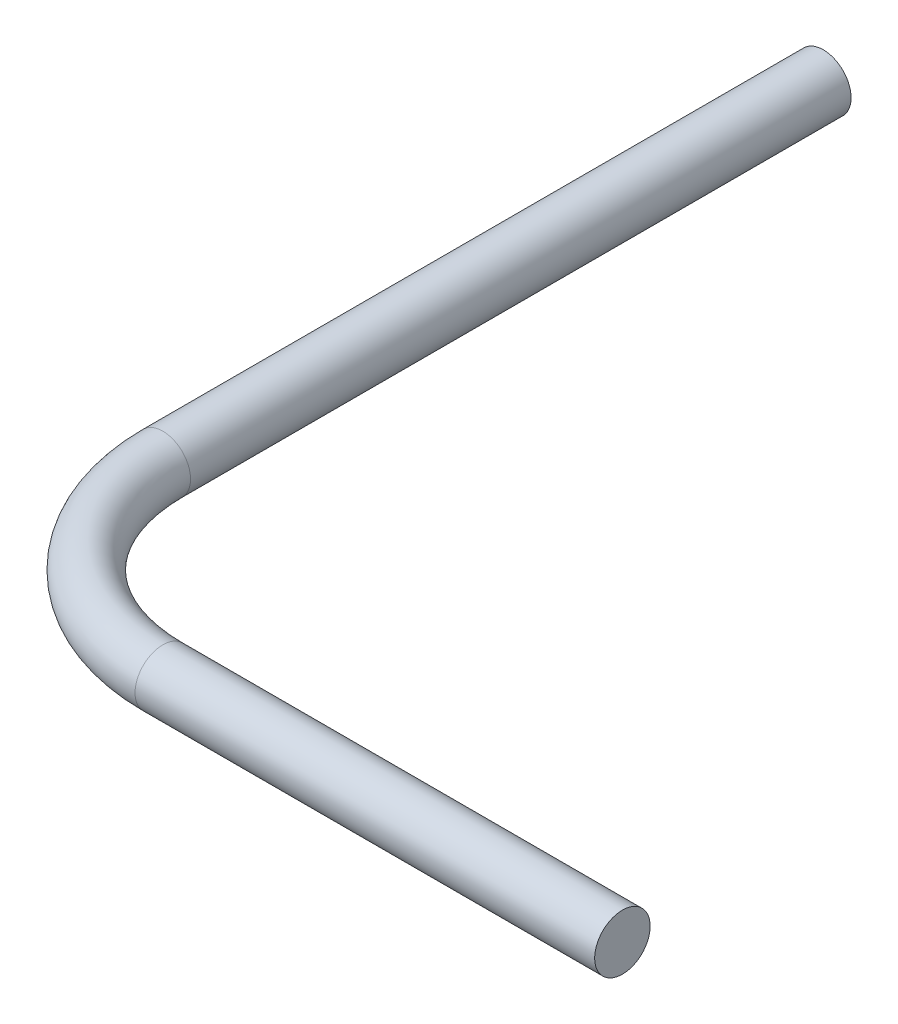
ISO-10303-21;
HEADER;
FILE_DESCRIPTION(('STEP AP214'),'2;1');
FILE_NAME('part.step','',(''),(''),'','','');
FILE_SCHEMA(('AUTOMOTIVE_DESIGN { 1 0 10303 214 1 1 1 1 }'));
ENDSEC;
DATA;
#1=APPLICATION_CONTEXT('core data for automotive mechanical design processes');
#2=APPLICATION_PROTOCOL_DEFINITION('international standard','automotive_design',2000,#1);
#3=PRODUCT_CONTEXT('',#1,'mechanical');
#4=PRODUCT('Part','Part','',(#3));
#5=PRODUCT_RELATED_PRODUCT_CATEGORY('part','',(#4));
#6=PRODUCT_DEFINITION_FORMATION('','',#4);
#7=PRODUCT_DEFINITION_CONTEXT('part definition',#1,'design');
#8=PRODUCT_DEFINITION('design','',#6,#7);
#9=PRODUCT_DEFINITION_SHAPE('','',#8);
#10=(LENGTH_UNIT() NAMED_UNIT(*) SI_UNIT(.MILLI.,.METRE.));
#11=(NAMED_UNIT(*) PLANE_ANGLE_UNIT() SI_UNIT($,.RADIAN.));
#12=(NAMED_UNIT(*) SI_UNIT($,.STERADIAN.) SOLID_ANGLE_UNIT());
#13=UNCERTAINTY_MEASURE_WITH_UNIT(LENGTH_MEASURE(1.E-05),#10,'distance_accuracy_value','');
#14=(GEOMETRIC_REPRESENTATION_CONTEXT(3) GLOBAL_UNCERTAINTY_ASSIGNED_CONTEXT((#13)) GLOBAL_UNIT_ASSIGNED_CONTEXT((#10,
#11,#12)) REPRESENTATION_CONTEXT('',''));
#15=CARTESIAN_POINT('',(0.,0.,0.));
#16=DIRECTION('',(0.,0.,1.));
#17=DIRECTION('',(1.,0.,0.));
#18=AXIS2_PLACEMENT_3D('',#15,#16,#17);
#19=CARTESIAN_POINT('',(0.,0.,0.));
#20=DIRECTION('',(1.,0.,0.));
#21=DIRECTION('',(0.,0.,-1.));
#22=AXIS2_PLACEMENT_3D('',#19,#20,#21);
#23=PLANE('',#22);
#24=CARTESIAN_POINT('',(0.,0.,0.));
#25=DIRECTION('',(1.,0.,0.));
#26=DIRECTION('',(0.,0.,-1.));
#27=AXIS2_PLACEMENT_3D('',#24,#25,#26);
#28=CIRCLE('',#27,1.5);
#29=CARTESIAN_POINT('',(0.,0.,-1.5));
#30=VERTEX_POINT('',#29);
#31=EDGE_CURVE('E65',#30,#30,#28,.T.);
#32=ORIENTED_EDGE('',*,*,#31,.T.);
#33=EDGE_LOOP('',(#32));
#34=FACE_BOUND('',#33,.T.);
#35=ADVANCED_FACE('F51',(#34),#23,.T.);
#36=CARTESIAN_POINT('',(-34.84,0.,-45.7));
#37=DIRECTION('',(0.,0.,1.));
#38=DIRECTION('',(1.,0.,0.));
#39=AXIS2_PLACEMENT_3D('',#36,#37,#38);
#40=PLANE('',#39);
#41=CARTESIAN_POINT('',(-34.84,0.,-45.7));
#42=DIRECTION('',(0.,0.,1.));
#43=DIRECTION('',(1.,0.,0.));
#44=AXIS2_PLACEMENT_3D('',#41,#42,#43);
#45=CIRCLE('',#44,1.5);
#46=CARTESIAN_POINT('',(-33.34,0.,-45.7));
#47=VERTEX_POINT('',#46);
#48=EDGE_CURVE('E11',#47,#47,#45,.T.);
#49=ORIENTED_EDGE('',*,*,#48,.F.);
#50=EDGE_LOOP('',(#49));
#51=FACE_BOUND('',#50,.T.);
#52=ADVANCED_FACE('F75',(#51),#40,.F.);
#53=CARTESIAN_POINT('',(0.,0.,0.));
#54=DIRECTION('',(-1.,0.,0.));
#55=DIRECTION('',(0.,0.,1.));
#56=AXIS2_PLACEMENT_3D('',#53,#54,#55);
#57=CYLINDRICAL_SURFACE('',#56,1.5);
#58=CARTESIAN_POINT('',(-24.8399999999999,0.,0.));
#59=DIRECTION('',(1.,0.,0.));
#60=DIRECTION('',(0.,0.,-1.));
#61=AXIS2_PLACEMENT_3D('',#58,#59,#60);
#62=CIRCLE('',#61,1.5);
#63=CARTESIAN_POINT('',(-24.8399999999999,0.,1.5));
#64=VERTEX_POINT('',#63);
#65=EDGE_CURVE('E61',#64,#64,#62,.T.);
#66=ORIENTED_EDGE('',*,*,#65,.T.);
#67=EDGE_LOOP('',(#66));
#68=FACE_BOUND('',#67,.T.);
#69=ORIENTED_EDGE('',*,*,#31,.F.);
#70=EDGE_LOOP('',(#69));
#71=FACE_BOUND('',#70,.T.);
#72=ADVANCED_FACE('F72',(#68,#71),#57,.T.);
#73=CARTESIAN_POINT('',(-24.84,0.,-10.));
#74=DIRECTION('',(0.,-1.,0.));
#75=DIRECTION('',(0.,0.,-1.));
#76=AXIS2_PLACEMENT_3D('',#73,#74,#75);
#77=TOROIDAL_SURFACE('',#76,10.,1.5);
#78=CARTESIAN_POINT('',(-34.8400000000003,0.,-9.99999999999982));
#79=DIRECTION('',(0.,0.,1.));
#80=DIRECTION('',(1.,0.,0.));
#81=AXIS2_PLACEMENT_3D('',#78,#79,#80);
#82=CIRCLE('',#81,1.5);
#83=CARTESIAN_POINT('',(-36.34,0.,-9.9999999999998));
#84=VERTEX_POINT('',#83);
#85=EDGE_CURVE('E57',#84,#84,#82,.T.);
#86=CARTESIAN_POINT('',(-24.84,0.,-10.));
#87=DIRECTION('',(0.,-1.,0.));
#88=DIRECTION('',(0.,0.,-1.));
#89=AXIS2_PLACEMENT_3D('',#86,#87,#88);
#90=CIRCLE('',#89,11.5);
#91=EDGE_CURVE('',#64,#84,#90,.T.);
#92=ORIENTED_EDGE('',*,*,#65,.F.);
#93=ORIENTED_EDGE('',*,*,#85,.T.);
#94=ORIENTED_EDGE('',*,*,#91,.T.);
#95=ORIENTED_EDGE('',*,*,#91,.F.);
#96=EDGE_LOOP('',(#92,#94,#93,#95));
#97=FACE_BOUND('',#96,.T.);
#98=ADVANCED_FACE('F74',(#97),#77,.T.);
#99=CARTESIAN_POINT('',(-34.84,0.,-10.0000000000001));
#100=DIRECTION('',(0.,0.,-1.));
#101=DIRECTION('',(-1.,0.,0.));
#102=AXIS2_PLACEMENT_3D('',#99,#100,#101);
#103=CYLINDRICAL_SURFACE('',#102,1.5);
#104=ORIENTED_EDGE('',*,*,#48,.T.);
#105=EDGE_LOOP('',(#104));
#106=FACE_BOUND('',#105,.T.);
#107=ORIENTED_EDGE('',*,*,#85,.F.);
#108=EDGE_LOOP('',(#107));
#109=FACE_BOUND('',#108,.T.);
#110=ADVANCED_FACE('F82',(#106,#109),#103,.T.);
#111=CLOSED_SHELL('',(#35,#52,#72,#98,#110));
#112=MANIFOLD_SOLID_BREP('B2',#111);
#113=ADVANCED_BREP_SHAPE_REPRESENTATION('',(#18,#112),#14);
#114=SHAPE_DEFINITION_REPRESENTATION(#9,#113);
ENDSEC;
END-ISO-10303-21;
